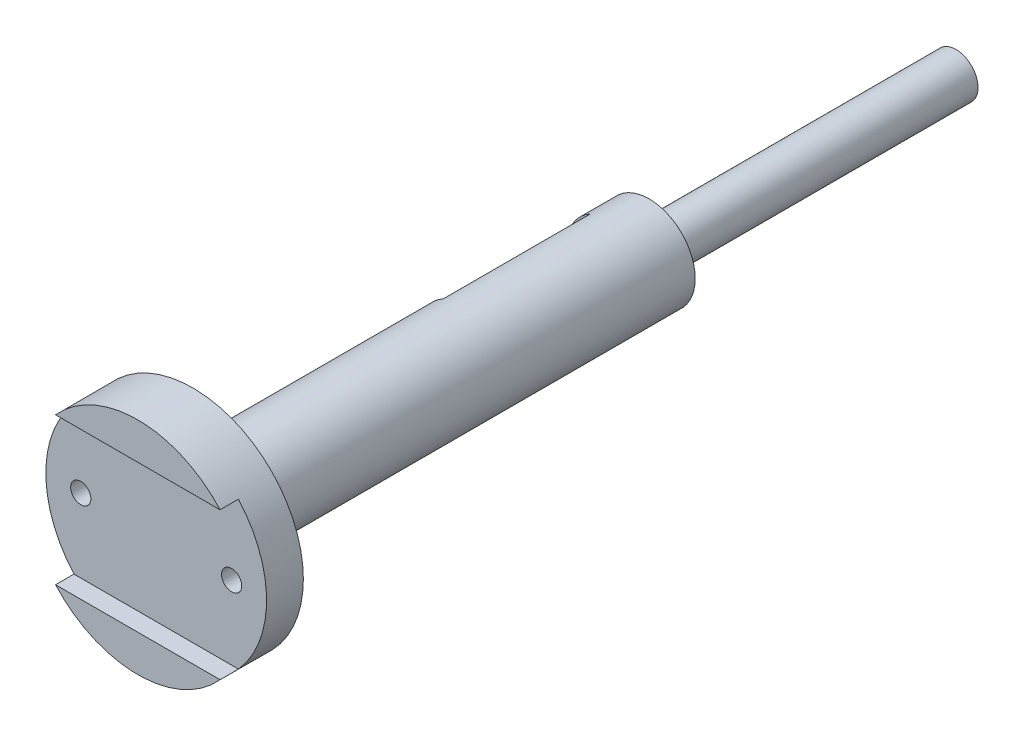
ISO-10303-21;
HEADER;
FILE_DESCRIPTION(('STEP AP214'),'2;1');
FILE_NAME('part.step','',(''),(''),'','','');
FILE_SCHEMA(('AUTOMOTIVE_DESIGN { 1 0 10303 214 1 1 1 1 }'));
ENDSEC;
DATA;
#1=APPLICATION_CONTEXT('core data for automotive mechanical design processes');
#2=APPLICATION_PROTOCOL_DEFINITION('international standard','automotive_design',2000,#1);
#3=PRODUCT_CONTEXT('',#1,'mechanical');
#4=PRODUCT('Part','Part','',(#3));
#5=PRODUCT_RELATED_PRODUCT_CATEGORY('part','',(#4));
#6=PRODUCT_DEFINITION_FORMATION('','',#4);
#7=PRODUCT_DEFINITION_CONTEXT('part definition',#1,'design');
#8=PRODUCT_DEFINITION('design','',#6,#7);
#9=PRODUCT_DEFINITION_SHAPE('','',#8);
#10=(LENGTH_UNIT() NAMED_UNIT(*) SI_UNIT(.MILLI.,.METRE.));
#11=(NAMED_UNIT(*) PLANE_ANGLE_UNIT() SI_UNIT($,.RADIAN.));
#12=(NAMED_UNIT(*) SI_UNIT($,.STERADIAN.) SOLID_ANGLE_UNIT());
#13=UNCERTAINTY_MEASURE_WITH_UNIT(LENGTH_MEASURE(1.E-05),#10,'distance_accuracy_value','');
#14=(GEOMETRIC_REPRESENTATION_CONTEXT(3) GLOBAL_UNCERTAINTY_ASSIGNED_CONTEXT((#13)) GLOBAL_UNIT_ASSIGNED_CONTEXT((#10,
#11,#12)) REPRESENTATION_CONTEXT('',''));
#15=CARTESIAN_POINT('',(0.,0.,0.));
#16=DIRECTION('',(0.,0.,1.));
#17=DIRECTION('',(1.,0.,0.));
#18=AXIS2_PLACEMENT_3D('',#15,#16,#17);
#19=CARTESIAN_POINT('',(-6.,10.9658560997307,-74.));
#20=DIRECTION('',(1.,0.,0.));
#21=DIRECTION('',(0.,0.,-1.));
#22=AXIS2_PLACEMENT_3D('',#19,#20,#21);
#23=PLANE('',#22);
#24=CARTESIAN_POINT('',(-6.,5.85067254011684,-82.1000000000048));
#25=DIRECTION('',(-1.,0.,0.));
#26=DIRECTION('',(0.,0.,1.));
#27=AXIS2_PLACEMENT_3D('',#24,#25,#26);
#28=CIRCLE('',#27,2.24999999999999);
#29=CARTESIAN_POINT('',(-6.,5.85067254011684,-79.8500000000048));
#30=VERTEX_POINT('',#29);
#31=EDGE_CURVE('E129',#30,#30,#28,.T.);
#32=ORIENTED_EDGE('',*,*,#31,.F.);
#33=EDGE_LOOP('',(#32));
#34=FACE_BOUND('',#33,.T.);
#35=CARTESIAN_POINT('',(-6.,-2.14932745988328,-93.1000000000048));
#36=DIRECTION('',(-1.,0.,0.));
#37=DIRECTION('',(0.,0.,1.));
#38=AXIS2_PLACEMENT_3D('',#35,#36,#37);
#39=CIRCLE('',#38,2.24999999999999);
#40=CARTESIAN_POINT('',(-6.,-2.14932745988328,-90.8500000000048));
#41=VERTEX_POINT('',#40);
#42=EDGE_CURVE('E128',#41,#41,#39,.T.);
#43=ORIENTED_EDGE('',*,*,#42,.F.);
#44=EDGE_LOOP('',(#43));
#45=FACE_BOUND('',#44,.T.);
#46=CARTESIAN_POINT('',(-6.,5.85067254011673,-93.1000000000048));
#47=DIRECTION('',(-1.,0.,0.));
#48=DIRECTION('',(0.,0.,1.));
#49=AXIS2_PLACEMENT_3D('',#46,#47,#48);
#50=CIRCLE('',#49,2.24999999999999);
#51=CARTESIAN_POINT('',(-6.,5.85067254011673,-90.8500000000048));
#52=VERTEX_POINT('',#51);
#53=EDGE_CURVE('E139',#52,#52,#50,.T.);
#54=ORIENTED_EDGE('',*,*,#53,.F.);
#55=EDGE_LOOP('',(#54));
#56=FACE_BOUND('',#55,.T.);
#57=CARTESIAN_POINT('',(-6.,5.85067254011662,-104.100000000005));
#58=DIRECTION('',(-1.,0.,0.));
#59=DIRECTION('',(0.,0.,1.));
#60=AXIS2_PLACEMENT_3D('',#57,#58,#59);
#61=CIRCLE('',#60,2.24999999999999);
#62=CARTESIAN_POINT('',(-6.,5.85067254011662,-101.850000000005));
#63=VERTEX_POINT('',#62);
#64=EDGE_CURVE('E145',#63,#63,#61,.T.);
#65=ORIENTED_EDGE('',*,*,#64,.F.);
#66=EDGE_LOOP('',(#65));
#67=FACE_BOUND('',#66,.T.);
#68=DIRECTION('',(0.,1.,0.));
#69=VECTOR('',#68,1.);
#70=CARTESIAN_POINT('',(-6.,10.9658560997307,-114.));
#71=LINE('',#70,#69);
#72=CARTESIAN_POINT('',(-6.,-10.9658560997307,-114.));
#73=VERTEX_POINT('',#72);
#74=CARTESIAN_POINT('',(-6.,10.9658560997307,-114.));
#75=VERTEX_POINT('',#74);
#76=EDGE_CURVE('E11',#73,#75,#71,.T.);
#77=ORIENTED_EDGE('',*,*,#76,.F.);
#78=DIRECTION('',(0.,0.,-1.));
#79=VECTOR('',#78,1.);
#80=CARTESIAN_POINT('',(-6.,-10.9658560997307,-74.));
#81=LINE('',#80,#79);
#82=CARTESIAN_POINT('',(-6.,-10.9658560997307,-74.));
#83=VERTEX_POINT('',#82);
#84=EDGE_CURVE('E157',#83,#73,#81,.T.);
#85=ORIENTED_EDGE('',*,*,#84,.F.);
#86=DIRECTION('',(0.,-1.,0.));
#87=VECTOR('',#86,1.);
#88=CARTESIAN_POINT('',(-6.,10.9658560997307,-74.));
#89=LINE('',#88,#87);
#90=CARTESIAN_POINT('',(-6.,10.9658560997307,-74.));
#91=VERTEX_POINT('',#90);
#92=EDGE_CURVE('E154',#91,#83,#89,.T.);
#93=ORIENTED_EDGE('',*,*,#92,.F.);
#94=DIRECTION('',(0.,0.,-1.));
#95=VECTOR('',#94,1.);
#96=CARTESIAN_POINT('',(-6.,10.9658560997307,-74.));
#97=LINE('',#96,#95);
#98=EDGE_CURVE('E49',#91,#75,#97,.T.);
#99=ORIENTED_EDGE('',*,*,#98,.T.);
#100=EDGE_LOOP('',(#77,#85,#93,#99));
#101=FACE_BOUND('',#100,.T.);
#102=ADVANCED_FACE('F34',(#34,#45,#56,#67,#101),#23,.F.);
#103=CARTESIAN_POINT('',(0.,0.,15.));
#104=DIRECTION('',(0.,0.,1.));
#105=DIRECTION('',(1.,0.,0.));
#106=AXIS2_PLACEMENT_3D('',#103,#104,#105);
#107=PLANE('',#106);
#108=DIRECTION('',(-1.,0.,0.));
#109=VECTOR('',#108,1.);
#110=CARTESIAN_POINT('',(0.,20.,15.));
#111=LINE('',#110,#109);
#112=CARTESIAN_POINT('',(22.3606797749979,20.,15.));
#113=VERTEX_POINT('',#112);
#114=CARTESIAN_POINT('',(-22.3606797749979,20.,15.));
#115=VERTEX_POINT('',#114);
#116=EDGE_CURVE('E249',#113,#115,#111,.T.);
#117=ORIENTED_EDGE('',*,*,#116,.F.);
#118=CARTESIAN_POINT('',(0.,0.,15.));
#119=DIRECTION('',(0.,0.,1.));
#120=DIRECTION('',(1.,0.,0.));
#121=AXIS2_PLACEMENT_3D('',#118,#119,#120);
#122=CIRCLE('',#121,30.);
#123=EDGE_CURVE('E238',#113,#115,#122,.T.);
#124=ORIENTED_EDGE('',*,*,#123,.T.);
#125=EDGE_LOOP('',(#117,#124));
#126=FACE_BOUND('',#125,.T.);
#127=ADVANCED_FACE('F270',(#126),#107,.T.);
#128=CARTESIAN_POINT('',(0.,0.,15.));
#129=DIRECTION('',(0.,0.,-1.));
#130=DIRECTION('',(-1.,0.,0.));
#131=AXIS2_PLACEMENT_3D('',#128,#129,#130);
#132=CYLINDRICAL_SURFACE('',#131,30.);
#133=ORIENTED_EDGE('',*,*,#123,.F.);
#134=DIRECTION('',(0.,0.,-1.));
#135=VECTOR('',#134,1.);
#136=CARTESIAN_POINT('',(22.3606797749979,20.,15.));
#137=LINE('',#136,#135);
#138=CARTESIAN_POINT('',(22.3606797749979,20.,10.));
#139=VERTEX_POINT('',#138);
#140=EDGE_CURVE('E231',#113,#139,#137,.T.);
#141=ORIENTED_EDGE('',*,*,#140,.T.);
#142=CARTESIAN_POINT('',(0.,0.,10.));
#143=DIRECTION('',(0.,0.,-1.));
#144=DIRECTION('',(-1.,0.,0.));
#145=AXIS2_PLACEMENT_3D('',#142,#143,#144);
#146=CIRCLE('',#145,30.);
#147=CARTESIAN_POINT('',(22.3606797749979,-20.,10.));
#148=VERTEX_POINT('',#147);
#149=EDGE_CURVE('E254',#139,#148,#146,.T.);
#150=ORIENTED_EDGE('',*,*,#149,.T.);
#151=DIRECTION('',(0.,0.,-1.));
#152=VECTOR('',#151,1.);
#153=CARTESIAN_POINT('',(22.3606797749979,-20.,15.));
#154=LINE('',#153,#152);
#155=CARTESIAN_POINT('',(22.3606797749979,-20.,15.));
#156=VERTEX_POINT('',#155);
#157=EDGE_CURVE('E222',#148,#156,#154,.F.);
#158=ORIENTED_EDGE('',*,*,#157,.T.);
#159=CARTESIAN_POINT('',(-22.3606797749979,-20.,15.));
#160=VERTEX_POINT('',#159);
#161=EDGE_CURVE('E242',#160,#156,#122,.T.);
#162=ORIENTED_EDGE('',*,*,#161,.F.);
#163=DIRECTION('',(0.,0.,-1.));
#164=VECTOR('',#163,1.);
#165=CARTESIAN_POINT('',(-22.3606797749979,-20.,15.));
#166=LINE('',#165,#164);
#167=CARTESIAN_POINT('',(-22.3606797749979,-20.,10.));
#168=VERTEX_POINT('',#167);
#169=EDGE_CURVE('E225',#160,#168,#166,.T.);
#170=ORIENTED_EDGE('',*,*,#169,.T.);
#171=CARTESIAN_POINT('',(-22.3606797749979,20.,10.));
#172=VERTEX_POINT('',#171);
#173=EDGE_CURVE('E251',#168,#172,#146,.T.);
#174=ORIENTED_EDGE('',*,*,#173,.T.);
#175=DIRECTION('',(0.,0.,-1.));
#176=VECTOR('',#175,1.);
#177=CARTESIAN_POINT('',(-22.3606797749979,20.,15.));
#178=LINE('',#177,#176);
#179=EDGE_CURVE('E228',#172,#115,#178,.F.);
#180=ORIENTED_EDGE('',*,*,#179,.T.);
#181=EDGE_LOOP('',(#133,#141,#150,#158,#162,#170,#174,#180));
#182=FACE_BOUND('',#181,.T.);
#183=CARTESIAN_POINT('',(0.,0.,0.));
#184=DIRECTION('',(0.,0.,1.));
#185=DIRECTION('',(1.,0.,0.));
#186=AXIS2_PLACEMENT_3D('',#183,#184,#185);
#187=CIRCLE('',#186,30.);
#188=CARTESIAN_POINT('',(30.,0.,0.));
#189=VERTEX_POINT('',#188);
#190=EDGE_CURVE('E237',#189,#189,#187,.T.);
#191=ORIENTED_EDGE('',*,*,#190,.T.);
#192=EDGE_LOOP('',(#191));
#193=FACE_BOUND('',#192,.T.);
#194=ADVANCED_FACE('F36',(#182,#193),#132,.T.);
#195=DIRECTION('',(1.,0.,0.));
#196=VECTOR('',#195,1.);
#197=CARTESIAN_POINT('',(0.,-20.,15.));
#198=LINE('',#197,#196);
#199=EDGE_CURVE('E247',#160,#156,#198,.T.);
#200=ORIENTED_EDGE('',*,*,#199,.F.);
#201=ORIENTED_EDGE('',*,*,#161,.T.);
#202=EDGE_LOOP('',(#200,#201));
#203=FACE_BOUND('',#202,.T.);
#204=ADVANCED_FACE('F278',(#203),#107,.T.);
#205=CARTESIAN_POINT('',(0.,0.,0.));
#206=DIRECTION('',(0.,0.,1.));
#207=DIRECTION('',(1.,0.,0.));
#208=AXIS2_PLACEMENT_3D('',#205,#206,#207);
#209=PLANE('',#208);
#210=CARTESIAN_POINT('',(-20.5,0.,0.));
#211=DIRECTION('',(0.,0.,-1.));
#212=DIRECTION('',(-1.,0.,0.));
#213=AXIS2_PLACEMENT_3D('',#210,#211,#212);
#214=CIRCLE('',#213,6.12);
#215=CARTESIAN_POINT('',(-26.62,0.,0.));
#216=VERTEX_POINT('',#215);
#217=EDGE_CURVE('E188',#216,#216,#214,.T.);
#218=ORIENTED_EDGE('',*,*,#217,.F.);
#219=EDGE_LOOP('',(#218));
#220=FACE_BOUND('',#219,.T.);
#221=CARTESIAN_POINT('',(20.5,0.,0.));
#222=DIRECTION('',(0.,0.,-1.));
#223=DIRECTION('',(-1.,0.,0.));
#224=AXIS2_PLACEMENT_3D('',#221,#222,#223);
#225=CIRCLE('',#224,6.12);
#226=CARTESIAN_POINT('',(14.38,0.,0.));
#227=VERTEX_POINT('',#226);
#228=EDGE_CURVE('E203',#227,#227,#225,.T.);
#229=ORIENTED_EDGE('',*,*,#228,.F.);
#230=EDGE_LOOP('',(#229));
#231=FACE_BOUND('',#230,.T.);
#232=CARTESIAN_POINT('',(0.,0.,0.));
#233=DIRECTION('',(0.,0.,1.));
#234=DIRECTION('',(1.,0.,0.));
#235=AXIS2_PLACEMENT_3D('',#232,#233,#234);
#236=CIRCLE('',#235,12.5);
#237=CARTESIAN_POINT('',(12.5,0.,0.));
#238=VERTEX_POINT('',#237);
#239=EDGE_CURVE('E241',#238,#238,#236,.F.);
#240=ORIENTED_EDGE('',*,*,#239,.F.);
#241=EDGE_LOOP('',(#240));
#242=FACE_BOUND('',#241,.T.);
#243=ORIENTED_EDGE('',*,*,#190,.F.);
#244=EDGE_LOOP('',(#243));
#245=FACE_BOUND('',#244,.T.);
#246=ADVANCED_FACE('F357',(#220,#231,#242,#245),#209,.F.);
#247=CARTESIAN_POINT('',(0.,0.,-124.));
#248=DIRECTION('',(0.,0.,1.));
#249=DIRECTION('',(1.,0.,0.));
#250=AXIS2_PLACEMENT_3D('',#247,#248,#249);
#251=CYLINDRICAL_SURFACE('',#250,12.5);
#252=CARTESIAN_POINT('',(0.,0.,-124.));
#253=DIRECTION('',(0.,0.,-1.));
#254=DIRECTION('',(-1.,0.,0.));
#255=AXIS2_PLACEMENT_3D('',#252,#253,#254);
#256=CIRCLE('',#255,12.5);
#257=CARTESIAN_POINT('',(-12.5,0.,-124.));
#258=VERTEX_POINT('',#257);
#259=EDGE_CURVE('E234',#258,#258,#256,.T.);
#260=ORIENTED_EDGE('',*,*,#259,.F.);
#261=EDGE_LOOP('',(#260));
#262=FACE_BOUND('',#261,.T.);
#263=CARTESIAN_POINT('',(0.,0.,-114.));
#264=DIRECTION('',(0.,0.,-1.));
#265=DIRECTION('',(-1.,0.,0.));
#266=AXIS2_PLACEMENT_3D('',#263,#264,#265);
#267=CIRCLE('',#266,12.5);
#268=EDGE_CURVE('E151',#73,#75,#267,.T.);
#269=ORIENTED_EDGE('',*,*,#268,.T.);
#270=ORIENTED_EDGE('',*,*,#98,.F.);
#271=CARTESIAN_POINT('',(0.,0.,-74.));
#272=DIRECTION('',(0.,0.,1.));
#273=DIRECTION('',(1.,0.,0.));
#274=AXIS2_PLACEMENT_3D('',#271,#272,#273);
#275=CIRCLE('',#274,12.5);
#276=EDGE_CURVE('E42',#91,#83,#275,.T.);
#277=ORIENTED_EDGE('',*,*,#276,.T.);
#278=ORIENTED_EDGE('',*,*,#84,.T.);
#279=EDGE_LOOP('',(#269,#270,#277,#278));
#280=FACE_BOUND('',#279,.T.);
#281=ORIENTED_EDGE('',*,*,#239,.T.);
#282=EDGE_LOOP('',(#281));
#283=FACE_BOUND('',#282,.T.);
#284=ADVANCED_FACE('F264',(#262,#280,#283),#251,.T.);
#285=CARTESIAN_POINT('',(0.,0.,-124.));
#286=DIRECTION('',(0.,0.,-1.));
#287=DIRECTION('',(-1.,0.,0.));
#288=AXIS2_PLACEMENT_3D('',#285,#286,#287);
#289=PLANE('',#288);
#290=ORIENTED_EDGE('',*,*,#259,.T.);
#291=EDGE_LOOP('',(#290));
#292=FACE_BOUND('',#291,.T.);
#293=CARTESIAN_POINT('',(0.,0.,-124.));
#294=DIRECTION('',(0.,0.,-1.));
#295=DIRECTION('',(-1.,0.,0.));
#296=AXIS2_PLACEMENT_3D('',#293,#294,#295);
#297=CIRCLE('',#296,6.);
#298=CARTESIAN_POINT('',(-6.,0.,-124.));
#299=VERTEX_POINT('',#298);
#300=EDGE_CURVE('E184',#299,#299,#297,.T.);
#301=ORIENTED_EDGE('',*,*,#300,.F.);
#302=EDGE_LOOP('',(#301));
#303=FACE_BOUND('',#302,.T.);
#304=ADVANCED_FACE('F345',(#292,#303),#289,.T.);
#305=CARTESIAN_POINT('',(0.,0.,10.));
#306=DIRECTION('',(0.,0.,-1.));
#307=DIRECTION('',(-1.,0.,0.));
#308=AXIS2_PLACEMENT_3D('',#305,#306,#307);
#309=PLANE('',#308);
#310=CARTESIAN_POINT('',(-20.5,0.,10.));
#311=DIRECTION('',(0.,0.,-1.));
#312=DIRECTION('',(-1.,0.,0.));
#313=AXIS2_PLACEMENT_3D('',#310,#311,#312);
#314=CIRCLE('',#313,2.75);
#315=CARTESIAN_POINT('',(-23.25,0.,10.));
#316=VERTEX_POINT('',#315);
#317=EDGE_CURVE('E202',#316,#316,#314,.T.);
#318=ORIENTED_EDGE('',*,*,#317,.T.);
#319=EDGE_LOOP('',(#318));
#320=FACE_BOUND('',#319,.T.);
#321=CARTESIAN_POINT('',(20.5,0.,10.));
#322=DIRECTION('',(0.,0.,-1.));
#323=DIRECTION('',(-1.,0.,0.));
#324=AXIS2_PLACEMENT_3D('',#321,#322,#323);
#325=CIRCLE('',#324,2.75);
#326=CARTESIAN_POINT('',(17.75,0.,10.));
#327=VERTEX_POINT('',#326);
#328=EDGE_CURVE('E215',#327,#327,#325,.T.);
#329=ORIENTED_EDGE('',*,*,#328,.T.);
#330=EDGE_LOOP('',(#329));
#331=FACE_BOUND('',#330,.T.);
#332=DIRECTION('',(-1.,0.,0.));
#333=VECTOR('',#332,1.);
#334=CARTESIAN_POINT('',(115.,20.,10.));
#335=LINE('',#334,#333);
#336=EDGE_CURVE('E219',#139,#172,#335,.T.);
#337=ORIENTED_EDGE('',*,*,#336,.T.);
#338=ORIENTED_EDGE('',*,*,#173,.F.);
#339=DIRECTION('',(1.,0.,0.));
#340=VECTOR('',#339,1.);
#341=CARTESIAN_POINT('',(115.,-20.,10.));
#342=LINE('',#341,#340);
#343=EDGE_CURVE('E216',#168,#148,#342,.T.);
#344=ORIENTED_EDGE('',*,*,#343,.T.);
#345=ORIENTED_EDGE('',*,*,#149,.F.);
#346=EDGE_LOOP('',(#337,#338,#344,#345));
#347=FACE_BOUND('',#346,.T.);
#348=ADVANCED_FACE('F341',(#320,#331,#347),#309,.F.);
#349=CARTESIAN_POINT('',(115.,20.,10.));
#350=DIRECTION('',(0.,1.,0.));
#351=DIRECTION('',(-1.,0.,0.));
#352=AXIS2_PLACEMENT_3D('',#349,#350,#351);
#353=PLANE('',#352);
#354=ORIENTED_EDGE('',*,*,#116,.T.);
#355=ORIENTED_EDGE('',*,*,#179,.F.);
#356=ORIENTED_EDGE('',*,*,#336,.F.);
#357=ORIENTED_EDGE('',*,*,#140,.F.);
#358=EDGE_LOOP('',(#354,#355,#356,#357));
#359=FACE_BOUND('',#358,.T.);
#360=ADVANCED_FACE('F344',(#359),#353,.F.);
#361=CARTESIAN_POINT('',(115.,-20.,10.));
#362=DIRECTION('',(0.,-1.,0.));
#363=DIRECTION('',(1.,0.,0.));
#364=AXIS2_PLACEMENT_3D('',#361,#362,#363);
#365=PLANE('',#364);
#366=ORIENTED_EDGE('',*,*,#199,.T.);
#367=ORIENTED_EDGE('',*,*,#157,.F.);
#368=ORIENTED_EDGE('',*,*,#343,.F.);
#369=ORIENTED_EDGE('',*,*,#169,.F.);
#370=EDGE_LOOP('',(#366,#367,#368,#369));
#371=FACE_BOUND('',#370,.T.);
#372=ADVANCED_FACE('F339',(#371),#365,.F.);
#373=CARTESIAN_POINT('',(20.5,0.,0.));
#374=DIRECTION('',(0.,0.,-1.));
#375=DIRECTION('',(-1.,0.,0.));
#376=AXIS2_PLACEMENT_3D('',#373,#374,#375);
#377=CYLINDRICAL_SURFACE('',#376,2.75);
#378=CARTESIAN_POINT('',(20.5,0.,3.60500000000001));
#379=DIRECTION('',(0.,0.,-1.));
#380=DIRECTION('',(-1.,0.,0.));
#381=AXIS2_PLACEMENT_3D('',#378,#379,#380);
#382=CIRCLE('',#381,2.75);
#383=CARTESIAN_POINT('',(17.75,0.,3.60500000000001));
#384=VERTEX_POINT('',#383);
#385=EDGE_CURVE('E212',#384,#384,#382,.T.);
#386=ORIENTED_EDGE('',*,*,#385,.T.);
#387=EDGE_LOOP('',(#386));
#388=FACE_BOUND('',#387,.T.);
#389=ORIENTED_EDGE('',*,*,#328,.F.);
#390=EDGE_LOOP('',(#389));
#391=FACE_BOUND('',#390,.T.);
#392=ADVANCED_FACE('F335',(#388,#391),#377,.F.);
#393=CARTESIAN_POINT('',(20.5,0.,3.58));
#394=DIRECTION('',(0.,0.,-1.));
#395=DIRECTION('',(-1.,0.,0.));
#396=AXIS2_PLACEMENT_3D('',#393,#394,#395);
#397=CONICAL_SURFACE('',#396,2.775,0.785398163397292);
#398=ORIENTED_EDGE('',*,*,#385,.F.);
#399=EDGE_LOOP('',(#398));
#400=FACE_BOUND('',#399,.T.);
#401=CARTESIAN_POINT('',(20.5,0.,3.58));
#402=DIRECTION('',(0.,0.,-1.));
#403=DIRECTION('',(-1.,0.,0.));
#404=AXIS2_PLACEMENT_3D('',#401,#402,#403);
#405=CIRCLE('',#404,2.775);
#406=CARTESIAN_POINT('',(17.725,0.,3.58));
#407=VERTEX_POINT('',#406);
#408=EDGE_CURVE('E209',#407,#407,#405,.T.);
#409=ORIENTED_EDGE('',*,*,#408,.T.);
#410=EDGE_LOOP('',(#409));
#411=FACE_BOUND('',#410,.T.);
#412=ADVANCED_FACE('F331',(#400,#411),#397,.F.);
#413=CARTESIAN_POINT('',(23.275,0.,3.58));
#414=DIRECTION('',(0.,0.,1.));
#415=DIRECTION('',(1.,0.,0.));
#416=AXIS2_PLACEMENT_3D('',#413,#414,#415);
#417=PLANE('',#416);
#418=ORIENTED_EDGE('',*,*,#408,.F.);
#419=EDGE_LOOP('',(#418));
#420=FACE_BOUND('',#419,.T.);
#421=CARTESIAN_POINT('',(20.5,0.,3.58));
#422=DIRECTION('',(0.,0.,-1.));
#423=DIRECTION('',(-1.,0.,0.));
#424=AXIS2_PLACEMENT_3D('',#421,#422,#423);
#425=CIRCLE('',#424,6.12);
#426=CARTESIAN_POINT('',(14.38,0.,3.58));
#427=VERTEX_POINT('',#426);
#428=EDGE_CURVE('E206',#427,#427,#425,.T.);
#429=ORIENTED_EDGE('',*,*,#428,.T.);
#430=EDGE_LOOP('',(#429));
#431=FACE_BOUND('',#430,.T.);
#432=ADVANCED_FACE('F327',(#420,#431),#417,.F.);
#433=CARTESIAN_POINT('',(20.5,0.,0.));
#434=DIRECTION('',(0.,0.,-1.));
#435=DIRECTION('',(-1.,0.,0.));
#436=AXIS2_PLACEMENT_3D('',#433,#434,#435);
#437=CYLINDRICAL_SURFACE('',#436,6.12);
#438=ORIENTED_EDGE('',*,*,#428,.F.);
#439=EDGE_LOOP('',(#438));
#440=FACE_BOUND('',#439,.T.);
#441=ORIENTED_EDGE('',*,*,#228,.T.);
#442=EDGE_LOOP('',(#441));
#443=FACE_BOUND('',#442,.T.);
#444=ADVANCED_FACE('F323',(#440,#443),#437,.F.);
#445=CARTESIAN_POINT('',(-20.5,0.,0.));
#446=DIRECTION('',(0.,0.,-1.));
#447=DIRECTION('',(-1.,0.,0.));
#448=AXIS2_PLACEMENT_3D('',#445,#446,#447);
#449=CYLINDRICAL_SURFACE('',#448,2.75);
#450=CARTESIAN_POINT('',(-20.5,0.,3.60500000000001));
#451=DIRECTION('',(0.,0.,-1.));
#452=DIRECTION('',(-1.,0.,0.));
#453=AXIS2_PLACEMENT_3D('',#450,#451,#452);
#454=CIRCLE('',#453,2.75);
#455=CARTESIAN_POINT('',(-23.25,0.,3.60500000000001));
#456=VERTEX_POINT('',#455);
#457=EDGE_CURVE('E199',#456,#456,#454,.T.);
#458=ORIENTED_EDGE('',*,*,#457,.T.);
#459=EDGE_LOOP('',(#458));
#460=FACE_BOUND('',#459,.T.);
#461=ORIENTED_EDGE('',*,*,#317,.F.);
#462=EDGE_LOOP('',(#461));
#463=FACE_BOUND('',#462,.T.);
#464=ADVANCED_FACE('F319',(#460,#463),#449,.F.);
#465=CARTESIAN_POINT('',(-20.5,0.,3.58));
#466=DIRECTION('',(0.,0.,-1.));
#467=DIRECTION('',(-1.,0.,0.));
#468=AXIS2_PLACEMENT_3D('',#465,#466,#467);
#469=CONICAL_SURFACE('',#468,2.775,0.785398163397292);
#470=ORIENTED_EDGE('',*,*,#457,.F.);
#471=EDGE_LOOP('',(#470));
#472=FACE_BOUND('',#471,.T.);
#473=CARTESIAN_POINT('',(-20.5,0.,3.58));
#474=DIRECTION('',(0.,0.,-1.));
#475=DIRECTION('',(-1.,0.,0.));
#476=AXIS2_PLACEMENT_3D('',#473,#474,#475);
#477=CIRCLE('',#476,2.775);
#478=CARTESIAN_POINT('',(-23.275,0.,3.58));
#479=VERTEX_POINT('',#478);
#480=EDGE_CURVE('E196',#479,#479,#477,.T.);
#481=ORIENTED_EDGE('',*,*,#480,.T.);
#482=EDGE_LOOP('',(#481));
#483=FACE_BOUND('',#482,.T.);
#484=ADVANCED_FACE('F315',(#472,#483),#469,.F.);
#485=CARTESIAN_POINT('',(-17.725,0.,3.58));
#486=DIRECTION('',(0.,0.,1.));
#487=DIRECTION('',(1.,0.,0.));
#488=AXIS2_PLACEMENT_3D('',#485,#486,#487);
#489=PLANE('',#488);
#490=ORIENTED_EDGE('',*,*,#480,.F.);
#491=EDGE_LOOP('',(#490));
#492=FACE_BOUND('',#491,.T.);
#493=CARTESIAN_POINT('',(-20.5,0.,3.58));
#494=DIRECTION('',(0.,0.,-1.));
#495=DIRECTION('',(-1.,0.,0.));
#496=AXIS2_PLACEMENT_3D('',#493,#494,#495);
#497=CIRCLE('',#496,6.12);
#498=CARTESIAN_POINT('',(-26.62,0.,3.58));
#499=VERTEX_POINT('',#498);
#500=EDGE_CURVE('E193',#499,#499,#497,.T.);
#501=ORIENTED_EDGE('',*,*,#500,.T.);
#502=EDGE_LOOP('',(#501));
#503=FACE_BOUND('',#502,.T.);
#504=ADVANCED_FACE('F311',(#492,#503),#489,.F.);
#505=CARTESIAN_POINT('',(-20.5,0.,0.));
#506=DIRECTION('',(0.,0.,-1.));
#507=DIRECTION('',(-1.,0.,0.));
#508=AXIS2_PLACEMENT_3D('',#505,#506,#507);
#509=CYLINDRICAL_SURFACE('',#508,6.12);
#510=ORIENTED_EDGE('',*,*,#500,.F.);
#511=EDGE_LOOP('',(#510));
#512=FACE_BOUND('',#511,.T.);
#513=ORIENTED_EDGE('',*,*,#217,.T.);
#514=EDGE_LOOP('',(#513));
#515=FACE_BOUND('',#514,.T.);
#516=ADVANCED_FACE('F307',(#512,#515),#509,.F.);
#517=CARTESIAN_POINT('',(0.,0.,-207.38));
#518=DIRECTION('',(0.,0.,1.));
#519=DIRECTION('',(1.,0.,0.));
#520=AXIS2_PLACEMENT_3D('',#517,#518,#519);
#521=CYLINDRICAL_SURFACE('',#520,6.);
#522=CARTESIAN_POINT('',(0.,0.,-204.38));
#523=DIRECTION('',(0.,0.,-1.));
#524=DIRECTION('',(-1.,0.,0.));
#525=AXIS2_PLACEMENT_3D('',#522,#523,#524);
#526=CIRCLE('',#525,6.);
#527=CARTESIAN_POINT('',(-5.80947501931113,-1.5,-204.38));
#528=VERTEX_POINT('',#527);
#529=CARTESIAN_POINT('',(-5.80947501931113,1.5,-204.38));
#530=VERTEX_POINT('',#529);
#531=EDGE_CURVE('E261',#528,#530,#526,.T.);
#532=ORIENTED_EDGE('',*,*,#531,.F.);
#533=DIRECTION('',(0.,0.,1.));
#534=VECTOR('',#533,1.);
#535=CARTESIAN_POINT('',(-5.80947501931113,-1.5,-207.38));
#536=LINE('',#535,#534);
#537=CARTESIAN_POINT('',(-5.80947501931113,-1.5,-207.38));
#538=VERTEX_POINT('',#537);
#539=EDGE_CURVE('E181',#528,#538,#536,.F.);
#540=ORIENTED_EDGE('',*,*,#539,.T.);
#541=CARTESIAN_POINT('',(0.,0.,-207.38));
#542=DIRECTION('',(0.,0.,-1.));
#543=DIRECTION('',(-1.,0.,0.));
#544=AXIS2_PLACEMENT_3D('',#541,#542,#543);
#545=CIRCLE('',#544,6.);
#546=CARTESIAN_POINT('',(-5.80947501931113,1.5,-207.38));
#547=VERTEX_POINT('',#546);
#548=EDGE_CURVE('E185',#547,#538,#545,.T.);
#549=ORIENTED_EDGE('',*,*,#548,.F.);
#550=DIRECTION('',(0.,0.,1.));
#551=VECTOR('',#550,1.);
#552=CARTESIAN_POINT('',(-5.80947501931113,1.5,-207.38));
#553=LINE('',#552,#551);
#554=EDGE_CURVE('E176',#547,#530,#553,.T.);
#555=ORIENTED_EDGE('',*,*,#554,.T.);
#556=EDGE_LOOP('',(#532,#540,#549,#555));
#557=FACE_BOUND('',#556,.T.);
#558=ORIENTED_EDGE('',*,*,#300,.T.);
#559=EDGE_LOOP('',(#558));
#560=FACE_BOUND('',#559,.T.);
#561=ADVANCED_FACE('F303',(#557,#560),#521,.T.);
#562=CARTESIAN_POINT('',(0.,0.,-207.38));
#563=DIRECTION('',(0.,0.,-1.));
#564=DIRECTION('',(-1.,0.,0.));
#565=AXIS2_PLACEMENT_3D('',#562,#563,#564);
#566=PLANE('',#565);
#567=DIRECTION('',(-1.,0.,0.));
#568=VECTOR('',#567,1.);
#569=CARTESIAN_POINT('',(3.39095353514196,-1.5,-207.38));
#570=LINE('',#569,#568);
#571=CARTESIAN_POINT('',(3.39095353514196,-1.5,-207.38));
#572=VERTEX_POINT('',#571);
#573=EDGE_CURVE('E164',#572,#538,#570,.T.);
#574=ORIENTED_EDGE('',*,*,#573,.F.);
#575=DIRECTION('',(0.,-1.,0.));
#576=VECTOR('',#575,1.);
#577=CARTESIAN_POINT('',(3.39095353514196,1.5,-207.38));
#578=LINE('',#577,#576);
#579=CARTESIAN_POINT('',(3.39095353514196,1.5,-207.38));
#580=VERTEX_POINT('',#579);
#581=EDGE_CURVE('E159',#580,#572,#578,.T.);
#582=ORIENTED_EDGE('',*,*,#581,.F.);
#583=DIRECTION('',(1.,0.,0.));
#584=VECTOR('',#583,1.);
#585=CARTESIAN_POINT('',(0.,1.5,-207.38));
#586=LINE('',#585,#584);
#587=EDGE_CURVE('E259',#547,#580,#586,.T.);
#588=ORIENTED_EDGE('',*,*,#587,.F.);
#589=ORIENTED_EDGE('',*,*,#548,.T.);
#590=EDGE_LOOP('',(#574,#582,#588,#589));
#591=FACE_BOUND('',#590,.T.);
#592=ADVANCED_FACE('F288',(#591),#566,.T.);
#593=CARTESIAN_POINT('',(0.,0.,-204.38));
#594=DIRECTION('',(0.,0.,-1.));
#595=DIRECTION('',(-1.,0.,0.));
#596=AXIS2_PLACEMENT_3D('',#593,#594,#595);
#597=PLANE('',#596);
#598=ORIENTED_EDGE('',*,*,#531,.T.);
#599=DIRECTION('',(1.,0.,0.));
#600=VECTOR('',#599,1.);
#601=CARTESIAN_POINT('',(3.39095353514196,1.5,-204.38));
#602=LINE('',#601,#600);
#603=CARTESIAN_POINT('',(3.39095353514196,1.5,-204.38));
#604=VERTEX_POINT('',#603);
#605=EDGE_CURVE('E161',#530,#604,#602,.T.);
#606=ORIENTED_EDGE('',*,*,#605,.T.);
#607=DIRECTION('',(0.,-1.,0.));
#608=VECTOR('',#607,1.);
#609=CARTESIAN_POINT('',(3.39095353514196,1.5,-204.38));
#610=LINE('',#609,#608);
#611=CARTESIAN_POINT('',(3.39095353514196,-1.5,-204.38));
#612=VERTEX_POINT('',#611);
#613=EDGE_CURVE('E163',#604,#612,#610,.T.);
#614=ORIENTED_EDGE('',*,*,#613,.T.);
#615=DIRECTION('',(-1.,0.,0.));
#616=VECTOR('',#615,1.);
#617=CARTESIAN_POINT('',(3.39095353514196,-1.5,-204.38));
#618=LINE('',#617,#616);
#619=EDGE_CURVE('E167',#612,#528,#618,.T.);
#620=ORIENTED_EDGE('',*,*,#619,.T.);
#621=EDGE_LOOP('',(#598,#606,#614,#620));
#622=FACE_BOUND('',#621,.T.);
#623=ADVANCED_FACE('F284',(#622),#597,.T.);
#624=CARTESIAN_POINT('',(3.39095353514196,-1.5,-204.38));
#625=DIRECTION('',(0.,-1.,0.));
#626=DIRECTION('',(0.,0.,-1.));
#627=AXIS2_PLACEMENT_3D('',#624,#625,#626);
#628=PLANE('',#627);
#629=ORIENTED_EDGE('',*,*,#619,.F.);
#630=DIRECTION('',(0.,0.,-1.));
#631=VECTOR('',#630,1.);
#632=CARTESIAN_POINT('',(3.39095353514196,-1.5,-204.38));
#633=LINE('',#632,#631);
#634=EDGE_CURVE('E174',#612,#572,#633,.T.);
#635=ORIENTED_EDGE('',*,*,#634,.T.);
#636=ORIENTED_EDGE('',*,*,#573,.T.);
#637=ORIENTED_EDGE('',*,*,#539,.F.);
#638=EDGE_LOOP('',(#629,#635,#636,#637));
#639=FACE_BOUND('',#638,.T.);
#640=ADVANCED_FACE('F287',(#639),#628,.F.);
#641=CARTESIAN_POINT('',(3.39095353514196,1.5,-204.38));
#642=DIRECTION('',(0.,1.,0.));
#643=DIRECTION('',(0.,0.,1.));
#644=AXIS2_PLACEMENT_3D('',#641,#642,#643);
#645=PLANE('',#644);
#646=ORIENTED_EDGE('',*,*,#587,.T.);
#647=DIRECTION('',(0.,0.,-1.));
#648=VECTOR('',#647,1.);
#649=CARTESIAN_POINT('',(3.39095353514196,1.5,-204.38));
#650=LINE('',#649,#648);
#651=EDGE_CURVE('E170',#604,#580,#650,.T.);
#652=ORIENTED_EDGE('',*,*,#651,.F.);
#653=ORIENTED_EDGE('',*,*,#605,.F.);
#654=ORIENTED_EDGE('',*,*,#554,.F.);
#655=EDGE_LOOP('',(#646,#652,#653,#654));
#656=FACE_BOUND('',#655,.T.);
#657=ADVANCED_FACE('F292',(#656),#645,.F.);
#658=CARTESIAN_POINT('',(3.39095353514196,1.5,-204.38));
#659=DIRECTION('',(1.,0.,0.));
#660=DIRECTION('',(0.,1.,0.));
#661=AXIS2_PLACEMENT_3D('',#658,#659,#660);
#662=PLANE('',#661);
#663=ORIENTED_EDGE('',*,*,#581,.T.);
#664=ORIENTED_EDGE('',*,*,#634,.F.);
#665=ORIENTED_EDGE('',*,*,#613,.F.);
#666=ORIENTED_EDGE('',*,*,#651,.T.);
#667=EDGE_LOOP('',(#663,#664,#665,#666));
#668=FACE_BOUND('',#667,.T.);
#669=ADVANCED_FACE('F294',(#668),#662,.F.);
#670=CARTESIAN_POINT('',(0.,0.,-74.));
#671=DIRECTION('',(0.,0.,1.));
#672=DIRECTION('',(1.,0.,0.));
#673=AXIS2_PLACEMENT_3D('',#670,#671,#672);
#674=PLANE('',#673);
#675=ORIENTED_EDGE('',*,*,#92,.T.);
#676=ORIENTED_EDGE('',*,*,#276,.F.);
#677=EDGE_LOOP('',(#675,#676));
#678=FACE_BOUND('',#677,.T.);
#679=ADVANCED_FACE('F268',(#678),#674,.F.);
#680=CARTESIAN_POINT('',(0.,0.,-114.));
#681=DIRECTION('',(0.,0.,-1.));
#682=DIRECTION('',(-1.,0.,0.));
#683=AXIS2_PLACEMENT_3D('',#680,#681,#682);
#684=PLANE('',#683);
#685=ORIENTED_EDGE('',*,*,#268,.F.);
#686=ORIENTED_EDGE('',*,*,#76,.T.);
#687=EDGE_LOOP('',(#685,#686));
#688=FACE_BOUND('',#687,.T.);
#689=ADVANCED_FACE('F504',(#688),#684,.F.);
#690=CARTESIAN_POINT('',(-3.,5.85067254011662,-104.100000000005));
#691=DIRECTION('',(-1.,0.,0.));
#692=DIRECTION('',(0.,0.,1.));
#693=AXIS2_PLACEMENT_3D('',#690,#691,#692);
#694=CONICAL_SURFACE('',#693,2.24999999999999,1.0471975511966);
#695=CARTESIAN_POINT('',(-1.70096189432334,5.85067254011662,-104.100000000005));
#696=VERTEX_POINT('',#695);
#697=VERTEX_LOOP('',#696);
#698=FACE_BOUND('',#697,.T.);
#699=CARTESIAN_POINT('',(-3.,5.85067254011662,-104.100000000005));
#700=DIRECTION('',(-1.,0.,0.));
#701=DIRECTION('',(0.,0.,1.));
#702=AXIS2_PLACEMENT_3D('',#699,#700,#701);
#703=CIRCLE('',#702,2.24999999999999);
#704=CARTESIAN_POINT('',(-3.,5.85067254011662,-101.850000000005));
#705=VERTEX_POINT('',#704);
#706=EDGE_CURVE('E148',#705,#705,#703,.T.);
#707=ORIENTED_EDGE('',*,*,#706,.T.);
#708=EDGE_LOOP('',(#707));
#709=FACE_BOUND('',#708,.T.);
#710=ADVANCED_FACE('F530',(#698,#709),#694,.F.);
#711=CARTESIAN_POINT('',(-6.,5.85067254011662,-104.100000000005));
#712=DIRECTION('',(-1.,0.,0.));
#713=DIRECTION('',(0.,0.,1.));
#714=AXIS2_PLACEMENT_3D('',#711,#712,#713);
#715=CYLINDRICAL_SURFACE('',#714,2.24999999999999);
#716=ORIENTED_EDGE('',*,*,#706,.F.);
#717=EDGE_LOOP('',(#716));
#718=FACE_BOUND('',#717,.T.);
#719=ORIENTED_EDGE('',*,*,#64,.T.);
#720=EDGE_LOOP('',(#719));
#721=FACE_BOUND('',#720,.T.);
#722=ADVANCED_FACE('F543',(#718,#721),#715,.F.);
#723=CARTESIAN_POINT('',(-3.,5.85067254011673,-93.1000000000048));
#724=DIRECTION('',(-1.,0.,0.));
#725=DIRECTION('',(0.,0.,1.));
#726=AXIS2_PLACEMENT_3D('',#723,#724,#725);
#727=CONICAL_SURFACE('',#726,2.24999999999999,1.0471975511966);
#728=CARTESIAN_POINT('',(-1.70096189432334,5.85067254011673,-93.1000000000048));
#729=VERTEX_POINT('',#728);
#730=VERTEX_LOOP('',#729);
#731=FACE_BOUND('',#730,.T.);
#732=CARTESIAN_POINT('',(-3.,5.85067254011673,-93.1000000000048));
#733=DIRECTION('',(-1.,0.,0.));
#734=DIRECTION('',(0.,0.,1.));
#735=AXIS2_PLACEMENT_3D('',#732,#733,#734);
#736=CIRCLE('',#735,2.24999999999999);
#737=CARTESIAN_POINT('',(-3.,5.85067254011673,-90.8500000000048));
#738=VERTEX_POINT('',#737);
#739=EDGE_CURVE('E142',#738,#738,#736,.T.);
#740=ORIENTED_EDGE('',*,*,#739,.T.);
#741=EDGE_LOOP('',(#740));
#742=FACE_BOUND('',#741,.T.);
#743=ADVANCED_FACE('F553',(#731,#742),#727,.F.);
#744=CARTESIAN_POINT('',(-6.,5.85067254011673,-93.1000000000048));
#745=DIRECTION('',(-1.,0.,0.));
#746=DIRECTION('',(0.,0.,1.));
#747=AXIS2_PLACEMENT_3D('',#744,#745,#746);
#748=CYLINDRICAL_SURFACE('',#747,2.24999999999999);
#749=ORIENTED_EDGE('',*,*,#739,.F.);
#750=EDGE_LOOP('',(#749));
#751=FACE_BOUND('',#750,.T.);
#752=ORIENTED_EDGE('',*,*,#53,.T.);
#753=EDGE_LOOP('',(#752));
#754=FACE_BOUND('',#753,.T.);
#755=ADVANCED_FACE('F563',(#751,#754),#748,.F.);
#756=CARTESIAN_POINT('',(-3.,-2.14932745988328,-93.1000000000048));
#757=DIRECTION('',(-1.,0.,0.));
#758=DIRECTION('',(0.,0.,1.));
#759=AXIS2_PLACEMENT_3D('',#756,#757,#758);
#760=CONICAL_SURFACE('',#759,2.24999999999999,1.0471975511966);
#761=CARTESIAN_POINT('',(-1.70096189432334,-2.14932745988328,-93.1000000000048));
#762=VERTEX_POINT('',#761);
#763=VERTEX_LOOP('',#762);
#764=FACE_BOUND('',#763,.T.);
#765=CARTESIAN_POINT('',(-3.,-2.14932745988328,-93.1000000000048));
#766=DIRECTION('',(-1.,0.,0.));
#767=DIRECTION('',(0.,0.,1.));
#768=AXIS2_PLACEMENT_3D('',#765,#766,#767);
#769=CIRCLE('',#768,2.24999999999999);
#770=CARTESIAN_POINT('',(-3.,-2.14932745988328,-90.8500000000048));
#771=VERTEX_POINT('',#770);
#772=EDGE_CURVE('E132',#771,#771,#769,.T.);
#773=ORIENTED_EDGE('',*,*,#772,.T.);
#774=EDGE_LOOP('',(#773));
#775=FACE_BOUND('',#774,.T.);
#776=ADVANCED_FACE('F573',(#764,#775),#760,.F.);
#777=CARTESIAN_POINT('',(-6.,-2.14932745988328,-93.1000000000048));
#778=DIRECTION('',(-1.,0.,0.));
#779=DIRECTION('',(0.,0.,1.));
#780=AXIS2_PLACEMENT_3D('',#777,#778,#779);
#781=CYLINDRICAL_SURFACE('',#780,2.24999999999999);
#782=ORIENTED_EDGE('',*,*,#772,.F.);
#783=EDGE_LOOP('',(#782));
#784=FACE_BOUND('',#783,.T.);
#785=ORIENTED_EDGE('',*,*,#42,.T.);
#786=EDGE_LOOP('',(#785));
#787=FACE_BOUND('',#786,.T.);
#788=ADVANCED_FACE('F122',(#784,#787),#781,.F.);
#789=CARTESIAN_POINT('',(-3.,5.85067254011684,-82.1000000000048));
#790=DIRECTION('',(-1.,0.,0.));
#791=DIRECTION('',(0.,0.,1.));
#792=AXIS2_PLACEMENT_3D('',#789,#790,#791);
#793=CONICAL_SURFACE('',#792,2.24999999999999,1.0471975511966);
#794=CARTESIAN_POINT('',(-1.70096189432334,5.85067254011684,-82.1000000000048));
#795=VERTEX_POINT('',#794);
#796=VERTEX_LOOP('',#795);
#797=FACE_BOUND('',#796,.T.);
#798=CARTESIAN_POINT('',(-3.,5.85067254011684,-82.1000000000048));
#799=DIRECTION('',(-1.,0.,0.));
#800=DIRECTION('',(0.,0.,1.));
#801=AXIS2_PLACEMENT_3D('',#798,#799,#800);
#802=CIRCLE('',#801,2.24999999999999);
#803=CARTESIAN_POINT('',(-3.,5.85067254011684,-79.8500000000048));
#804=VERTEX_POINT('',#803);
#805=EDGE_CURVE('E126',#804,#804,#802,.T.);
#806=ORIENTED_EDGE('',*,*,#805,.T.);
#807=EDGE_LOOP('',(#806));
#808=FACE_BOUND('',#807,.T.);
#809=ADVANCED_FACE('F118',(#797,#808),#793,.F.);
#810=CARTESIAN_POINT('',(-6.,5.85067254011684,-82.1000000000048));
#811=DIRECTION('',(-1.,0.,0.));
#812=DIRECTION('',(0.,0.,1.));
#813=AXIS2_PLACEMENT_3D('',#810,#811,#812);
#814=CYLINDRICAL_SURFACE('',#813,2.24999999999999);
#815=ORIENTED_EDGE('',*,*,#805,.F.);
#816=EDGE_LOOP('',(#815));
#817=FACE_BOUND('',#816,.T.);
#818=ORIENTED_EDGE('',*,*,#31,.T.);
#819=EDGE_LOOP('',(#818));
#820=FACE_BOUND('',#819,.T.);
#821=ADVANCED_FACE('F121',(#817,#820),#814,.F.);
#822=CLOSED_SHELL('',(#102,#127,#194,#204,#246,#284,#304,#348,#360,#372,#392,#412,#432,#444,
#464,#484,#504,#516,#561,#592,#623,#640,#657,#669,#679,#689,#710,#722,#743,#755,#776,#788,#809,#821));
#823=MANIFOLD_SOLID_BREP('B2',#822);
#824=ADVANCED_BREP_SHAPE_REPRESENTATION('',(#18,#823),#14);
#825=SHAPE_DEFINITION_REPRESENTATION(#9,#824);
ENDSEC;
END-ISO-10303-21;
